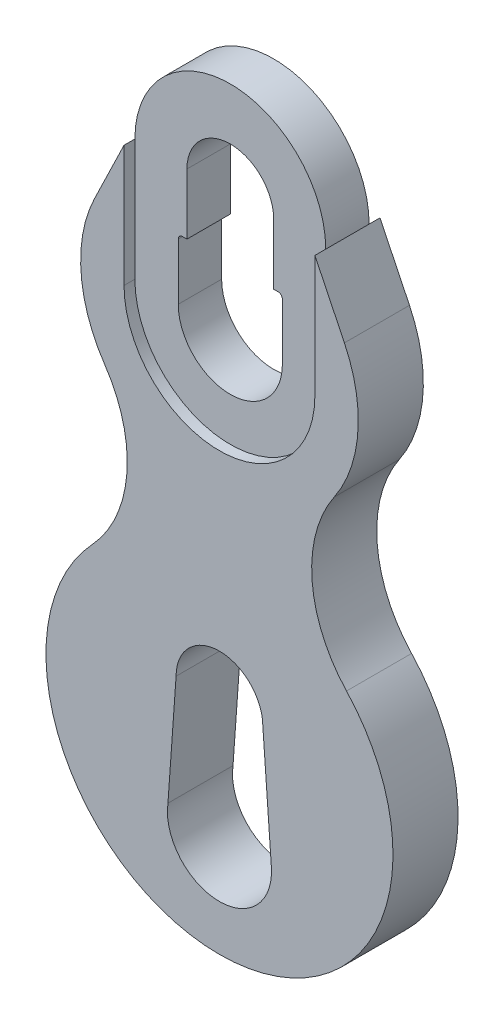
ISO-10303-21;
HEADER;
FILE_DESCRIPTION(('STEP AP214'),'2;1');
FILE_NAME('part.step','',(''),(''),'','','');
FILE_SCHEMA(('AUTOMOTIVE_DESIGN { 1 0 10303 214 1 1 1 1 }'));
ENDSEC;
DATA;
#1=APPLICATION_CONTEXT('core data for automotive mechanical design processes');
#2=APPLICATION_PROTOCOL_DEFINITION('international standard','automotive_design',2000,#1);
#3=PRODUCT_CONTEXT('',#1,'mechanical');
#4=PRODUCT('Part','Part','',(#3));
#5=PRODUCT_RELATED_PRODUCT_CATEGORY('part','',(#4));
#6=PRODUCT_DEFINITION_FORMATION('','',#4);
#7=PRODUCT_DEFINITION_CONTEXT('part definition',#1,'design');
#8=PRODUCT_DEFINITION('design','',#6,#7);
#9=PRODUCT_DEFINITION_SHAPE('','',#8);
#10=(LENGTH_UNIT() NAMED_UNIT(*) SI_UNIT(.MILLI.,.METRE.));
#11=(NAMED_UNIT(*) PLANE_ANGLE_UNIT() SI_UNIT($,.RADIAN.));
#12=(NAMED_UNIT(*) SI_UNIT($,.STERADIAN.) SOLID_ANGLE_UNIT());
#13=UNCERTAINTY_MEASURE_WITH_UNIT(LENGTH_MEASURE(1.E-05),#10,'distance_accuracy_value','');
#14=(GEOMETRIC_REPRESENTATION_CONTEXT(3) GLOBAL_UNCERTAINTY_ASSIGNED_CONTEXT((#13)) GLOBAL_UNIT_ASSIGNED_CONTEXT((#10,
#11,#12)) REPRESENTATION_CONTEXT('',''));
#15=CARTESIAN_POINT('',(0.,0.,0.));
#16=DIRECTION('',(0.,0.,1.));
#17=DIRECTION('',(1.,0.,0.));
#18=AXIS2_PLACEMENT_3D('',#15,#16,#17);
#19=CARTESIAN_POINT('',(-10.9999999999939,95.5634073663437,5.));
#20=DIRECTION('',(0.,0.,-1.));
#21=DIRECTION('',(-1.,0.,0.));
#22=AXIS2_PLACEMENT_3D('',#19,#20,#21);
#23=CYLINDRICAL_SURFACE('',#22,1.);
#24=CARTESIAN_POINT('',(-10.9999999999939,95.5634073663437,-5.));
#25=DIRECTION('',(0.,0.,1.));
#26=DIRECTION('',(1.,0.,0.));
#27=AXIS2_PLACEMENT_3D('',#24,#25,#26);
#28=CIRCLE('',#27,1.);
#29=CARTESIAN_POINT('',(-10.9999999999939,96.5634073663437,-5.));
#30=VERTEX_POINT('',#29);
#31=CARTESIAN_POINT('',(-11.9999999999939,95.5634073663437,-5.));
#32=VERTEX_POINT('',#31);
#33=EDGE_CURVE('E190',#30,#32,#28,.T.);
#34=ORIENTED_EDGE('',*,*,#33,.F.);
#35=DIRECTION('',(0.,0.,-1.));
#36=VECTOR('',#35,1.);
#37=CARTESIAN_POINT('',(-10.9999999999939,96.5634073663437,5.));
#38=LINE('',#37,#36);
#39=CARTESIAN_POINT('',(-10.9999999999939,96.5634073663437,5.));
#40=VERTEX_POINT('',#39);
#41=EDGE_CURVE('E48',#40,#30,#38,.T.);
#42=ORIENTED_EDGE('',*,*,#41,.F.);
#43=CARTESIAN_POINT('',(-10.9999999999939,95.5634073663437,5.));
#44=DIRECTION('',(0.,0.,1.));
#45=DIRECTION('',(1.,0.,0.));
#46=AXIS2_PLACEMENT_3D('',#43,#44,#45);
#47=CIRCLE('',#46,1.);
#48=CARTESIAN_POINT('',(-11.9999999999939,95.5634073663437,5.));
#49=VERTEX_POINT('',#48);
#50=EDGE_CURVE('E205',#40,#49,#47,.T.);
#51=ORIENTED_EDGE('',*,*,#50,.T.);
#52=DIRECTION('',(0.,0.,-1.));
#53=VECTOR('',#52,1.);
#54=CARTESIAN_POINT('',(-11.9999999999939,95.5634073663437,5.));
#55=LINE('',#54,#53);
#56=EDGE_CURVE('E232',#49,#32,#55,.T.);
#57=ORIENTED_EDGE('',*,*,#56,.T.);
#58=EDGE_LOOP('',(#34,#42,#51,#57));
#59=FACE_BOUND('',#58,.T.);
#60=ADVANCED_FACE('F45',(#59),#23,.F.);
#61=CARTESIAN_POINT('',(0.,96.5634073663437,5.));
#62=DIRECTION('',(0.,-1.,0.));
#63=DIRECTION('',(0.,0.,-1.));
#64=AXIS2_PLACEMENT_3D('',#61,#62,#63);
#65=PLANE('',#64);
#66=DIRECTION('',(-1.,0.,0.));
#67=VECTOR('',#66,1.);
#68=CARTESIAN_POINT('',(0.,96.5634073663437,-5.));
#69=LINE('',#68,#67);
#70=CARTESIAN_POINT('',(-9.99999999999389,96.5634073663437,-5.));
#71=VERTEX_POINT('',#70);
#72=EDGE_CURVE('E235',#71,#30,#69,.T.);
#73=ORIENTED_EDGE('',*,*,#72,.F.);
#74=DIRECTION('',(0.,0.,-1.));
#75=VECTOR('',#74,1.);
#76=CARTESIAN_POINT('',(-9.99999999999389,96.5634073663437,5.));
#77=LINE('',#76,#75);
#78=CARTESIAN_POINT('',(-9.99999999999389,96.5634073663437,5.));
#79=VERTEX_POINT('',#78);
#80=EDGE_CURVE('E287',#79,#71,#77,.T.);
#81=ORIENTED_EDGE('',*,*,#80,.F.);
#82=DIRECTION('',(-1.,0.,0.));
#83=VECTOR('',#82,1.);
#84=CARTESIAN_POINT('',(0.,96.5634073663437,5.));
#85=LINE('',#84,#83);
#86=EDGE_CURVE('E207',#79,#40,#85,.T.);
#87=ORIENTED_EDGE('',*,*,#86,.T.);
#88=ORIENTED_EDGE('',*,*,#41,.T.);
#89=EDGE_LOOP('',(#73,#81,#87,#88));
#90=FACE_BOUND('',#89,.T.);
#91=ADVANCED_FACE('F292',(#90),#65,.T.);
#92=CARTESIAN_POINT('',(-9.99999999999385,0.,5.));
#93=DIRECTION('',(1.,0.,0.));
#94=DIRECTION('',(0.,1.,0.));
#95=AXIS2_PLACEMENT_3D('',#92,#93,#94);
#96=PLANE('',#95);
#97=DIRECTION('',(0.,-1.,0.));
#98=VECTOR('',#97,1.);
#99=CARTESIAN_POINT('',(-9.99999999999385,0.,-5.));
#100=LINE('',#99,#98);
#101=CARTESIAN_POINT('',(-9.99999999999389,110.563407366342,-5.));
#102=VERTEX_POINT('',#101);
#103=EDGE_CURVE('E238',#102,#71,#100,.T.);
#104=ORIENTED_EDGE('',*,*,#103,.F.);
#105=DIRECTION('',(0.,0.,-1.));
#106=VECTOR('',#105,1.);
#107=CARTESIAN_POINT('',(-9.99999999999389,110.563407366342,5.));
#108=LINE('',#107,#106);
#109=CARTESIAN_POINT('',(-9.99999999999389,110.563407366342,5.));
#110=VERTEX_POINT('',#109);
#111=EDGE_CURVE('E286',#110,#102,#108,.T.);
#112=ORIENTED_EDGE('',*,*,#111,.F.);
#113=DIRECTION('',(0.,-1.,0.));
#114=VECTOR('',#113,1.);
#115=CARTESIAN_POINT('',(-9.99999999999385,0.,5.));
#116=LINE('',#115,#114);
#117=EDGE_CURVE('E210',#110,#79,#116,.T.);
#118=ORIENTED_EDGE('',*,*,#117,.T.);
#119=ORIENTED_EDGE('',*,*,#80,.T.);
#120=EDGE_LOOP('',(#104,#112,#118,#119));
#121=FACE_BOUND('',#120,.T.);
#122=ADVANCED_FACE('F300',(#121),#96,.T.);
#123=CARTESIAN_POINT('',(6.10969388344336E-12,110.563407366342,5.));
#124=DIRECTION('',(0.,0.,-1.));
#125=DIRECTION('',(-1.,0.,0.));
#126=AXIS2_PLACEMENT_3D('',#123,#124,#125);
#127=CYLINDRICAL_SURFACE('',#126,10.);
#128=CARTESIAN_POINT('',(6.10969388344336E-12,110.563407366342,-5.));
#129=DIRECTION('',(0.,0.,1.));
#130=DIRECTION('',(1.,0.,0.));
#131=AXIS2_PLACEMENT_3D('',#128,#129,#130);
#132=CIRCLE('',#131,10.);
#133=CARTESIAN_POINT('',(10.0000000000061,110.563407366342,-5.));
#134=VERTEX_POINT('',#133);
#135=EDGE_CURVE('E241',#134,#102,#132,.T.);
#136=ORIENTED_EDGE('',*,*,#135,.F.);
#137=DIRECTION('',(0.,0.,-1.));
#138=VECTOR('',#137,1.);
#139=CARTESIAN_POINT('',(10.0000000000061,110.563407366342,5.));
#140=LINE('',#139,#138);
#141=CARTESIAN_POINT('',(10.0000000000061,110.563407366342,5.));
#142=VERTEX_POINT('',#141);
#143=EDGE_CURVE('E284',#142,#134,#140,.T.);
#144=ORIENTED_EDGE('',*,*,#143,.F.);
#145=CARTESIAN_POINT('',(6.10969388344336E-12,110.563407366342,5.));
#146=DIRECTION('',(0.,0.,1.));
#147=DIRECTION('',(1.,0.,0.));
#148=AXIS2_PLACEMENT_3D('',#145,#146,#147);
#149=CIRCLE('',#148,10.);
#150=EDGE_CURVE('E213',#142,#110,#149,.T.);
#151=ORIENTED_EDGE('',*,*,#150,.T.);
#152=ORIENTED_EDGE('',*,*,#111,.T.);
#153=EDGE_LOOP('',(#136,#144,#151,#152));
#154=FACE_BOUND('',#153,.T.);
#155=ADVANCED_FACE('F305',(#154),#127,.F.);
#156=CARTESIAN_POINT('',(10.0000000000061,0.,5.));
#157=DIRECTION('',(1.,0.,0.));
#158=DIRECTION('',(0.,1.,0.));
#159=AXIS2_PLACEMENT_3D('',#156,#157,#158);
#160=PLANE('',#159);
#161=DIRECTION('',(0.,-1.,0.));
#162=VECTOR('',#161,1.);
#163=CARTESIAN_POINT('',(10.0000000000061,0.,-5.));
#164=LINE('',#163,#162);
#165=CARTESIAN_POINT('',(10.0000000000061,96.5634073663437,-5.));
#166=VERTEX_POINT('',#165);
#167=EDGE_CURVE('E244',#134,#166,#164,.T.);
#168=ORIENTED_EDGE('',*,*,#167,.T.);
#169=DIRECTION('',(0.,0.,-1.));
#170=VECTOR('',#169,1.);
#171=CARTESIAN_POINT('',(10.0000000000061,96.5634073663437,5.));
#172=LINE('',#171,#170);
#173=CARTESIAN_POINT('',(10.0000000000061,96.5634073663437,5.));
#174=VERTEX_POINT('',#173);
#175=EDGE_CURVE('E281',#174,#166,#172,.T.);
#176=ORIENTED_EDGE('',*,*,#175,.F.);
#177=DIRECTION('',(0.,-1.,0.));
#178=VECTOR('',#177,1.);
#179=CARTESIAN_POINT('',(10.0000000000061,0.,5.));
#180=LINE('',#179,#178);
#181=EDGE_CURVE('E216',#142,#174,#180,.T.);
#182=ORIENTED_EDGE('',*,*,#181,.F.);
#183=ORIENTED_EDGE('',*,*,#143,.T.);
#184=EDGE_LOOP('',(#168,#176,#182,#183));
#185=FACE_BOUND('',#184,.T.);
#186=ADVANCED_FACE('F309',(#185),#160,.F.);
#187=CARTESIAN_POINT('',(0.,96.5634073663437,5.));
#188=DIRECTION('',(0.,1.,0.));
#189=DIRECTION('',(0.,0.,1.));
#190=AXIS2_PLACEMENT_3D('',#187,#188,#189);
#191=PLANE('',#190);
#192=DIRECTION('',(1.,0.,0.));
#193=VECTOR('',#192,1.);
#194=CARTESIAN_POINT('',(0.,96.5634073663437,-5.));
#195=LINE('',#194,#193);
#196=CARTESIAN_POINT('',(11.0000000000061,96.5634073663437,-5.));
#197=VERTEX_POINT('',#196);
#198=EDGE_CURVE('E246',#166,#197,#195,.T.);
#199=ORIENTED_EDGE('',*,*,#198,.T.);
#200=DIRECTION('',(0.,0.,-1.));
#201=VECTOR('',#200,1.);
#202=CARTESIAN_POINT('',(11.0000000000061,96.5634073663437,5.));
#203=LINE('',#202,#201);
#204=CARTESIAN_POINT('',(11.0000000000061,96.5634073663437,5.));
#205=VERTEX_POINT('',#204);
#206=EDGE_CURVE('E278',#205,#197,#203,.T.);
#207=ORIENTED_EDGE('',*,*,#206,.F.);
#208=DIRECTION('',(1.,0.,0.));
#209=VECTOR('',#208,1.);
#210=CARTESIAN_POINT('',(0.,96.5634073663437,5.));
#211=LINE('',#210,#209);
#212=EDGE_CURVE('E218',#174,#205,#211,.T.);
#213=ORIENTED_EDGE('',*,*,#212,.F.);
#214=ORIENTED_EDGE('',*,*,#175,.T.);
#215=EDGE_LOOP('',(#199,#207,#213,#214));
#216=FACE_BOUND('',#215,.T.);
#217=ADVANCED_FACE('F315',(#216),#191,.F.);
#218=CARTESIAN_POINT('',(11.0000000000061,95.5634073663437,5.));
#219=DIRECTION('',(0.,0.,-1.));
#220=DIRECTION('',(-1.,0.,0.));
#221=AXIS2_PLACEMENT_3D('',#218,#219,#220);
#222=CYLINDRICAL_SURFACE('',#221,1.);
#223=CARTESIAN_POINT('',(11.0000000000061,95.5634073663437,-5.));
#224=DIRECTION('',(0.,0.,1.));
#225=DIRECTION('',(1.,0.,0.));
#226=AXIS2_PLACEMENT_3D('',#223,#224,#225);
#227=CIRCLE('',#226,1.);
#228=CARTESIAN_POINT('',(12.0000000000061,95.5634073663437,-5.));
#229=VERTEX_POINT('',#228);
#230=EDGE_CURVE('E248',#197,#229,#227,.F.);
#231=ORIENTED_EDGE('',*,*,#230,.T.);
#232=DIRECTION('',(0.,0.,-1.));
#233=VECTOR('',#232,1.);
#234=CARTESIAN_POINT('',(12.0000000000061,95.5634073663437,5.));
#235=LINE('',#234,#233);
#236=CARTESIAN_POINT('',(12.0000000000061,95.5634073663437,5.));
#237=VERTEX_POINT('',#236);
#238=EDGE_CURVE('E275',#237,#229,#235,.T.);
#239=ORIENTED_EDGE('',*,*,#238,.F.);
#240=CARTESIAN_POINT('',(11.0000000000061,95.5634073663437,5.));
#241=DIRECTION('',(0.,0.,1.));
#242=DIRECTION('',(1.,0.,0.));
#243=AXIS2_PLACEMENT_3D('',#240,#241,#242);
#244=CIRCLE('',#243,1.);
#245=EDGE_CURVE('E220',#205,#237,#244,.F.);
#246=ORIENTED_EDGE('',*,*,#245,.F.);
#247=ORIENTED_EDGE('',*,*,#206,.T.);
#248=EDGE_LOOP('',(#231,#239,#246,#247));
#249=FACE_BOUND('',#248,.T.);
#250=ADVANCED_FACE('F319',(#249),#222,.F.);
#251=CARTESIAN_POINT('',(12.0000000000061,0.,5.));
#252=DIRECTION('',(1.,0.,0.));
#253=DIRECTION('',(0.,1.,0.));
#254=AXIS2_PLACEMENT_3D('',#251,#252,#253);
#255=PLANE('',#254);
#256=DIRECTION('',(0.,-1.,0.));
#257=VECTOR('',#256,1.);
#258=CARTESIAN_POINT('',(12.0000000000061,0.,-5.));
#259=LINE('',#258,#257);
#260=CARTESIAN_POINT('',(12.0000000000061,82.5634073663423,-5.));
#261=VERTEX_POINT('',#260);
#262=EDGE_CURVE('E250',#229,#261,#259,.T.);
#263=ORIENTED_EDGE('',*,*,#262,.T.);
#264=DIRECTION('',(0.,0.,-1.));
#265=VECTOR('',#264,1.);
#266=CARTESIAN_POINT('',(12.0000000000061,82.5634073663423,5.));
#267=LINE('',#266,#265);
#268=CARTESIAN_POINT('',(12.0000000000061,82.5634073663423,5.));
#269=VERTEX_POINT('',#268);
#270=EDGE_CURVE('E273',#269,#261,#267,.T.);
#271=ORIENTED_EDGE('',*,*,#270,.F.);
#272=DIRECTION('',(0.,-1.,0.));
#273=VECTOR('',#272,1.);
#274=CARTESIAN_POINT('',(12.0000000000061,0.,5.));
#275=LINE('',#274,#273);
#276=EDGE_CURVE('E222',#237,#269,#275,.T.);
#277=ORIENTED_EDGE('',*,*,#276,.F.);
#278=ORIENTED_EDGE('',*,*,#238,.T.);
#279=EDGE_LOOP('',(#263,#271,#277,#278));
#280=FACE_BOUND('',#279,.T.);
#281=ADVANCED_FACE('F324',(#280),#255,.F.);
#282=CARTESIAN_POINT('',(0.,82.5634073663423,5.));
#283=DIRECTION('',(0.,0.,-1.));
#284=DIRECTION('',(-1.,0.,0.));
#285=AXIS2_PLACEMENT_3D('',#282,#283,#284);
#286=CYLINDRICAL_SURFACE('',#285,12.);
#287=CARTESIAN_POINT('',(0.,82.5634073663423,-5.));
#288=DIRECTION('',(0.,0.,1.));
#289=DIRECTION('',(1.,0.,0.));
#290=AXIS2_PLACEMENT_3D('',#287,#288,#289);
#291=CIRCLE('',#290,12.);
#292=CARTESIAN_POINT('',(-11.9999999999939,82.5634073663423,-5.));
#293=VERTEX_POINT('',#292);
#294=EDGE_CURVE('E253',#293,#261,#291,.T.);
#295=ORIENTED_EDGE('',*,*,#294,.F.);
#296=DIRECTION('',(0.,0.,-1.));
#297=VECTOR('',#296,1.);
#298=CARTESIAN_POINT('',(-11.9999999999939,82.5634073663423,5.));
#299=LINE('',#298,#297);
#300=CARTESIAN_POINT('',(-11.9999999999939,82.5634073663423,5.));
#301=VERTEX_POINT('',#300);
#302=EDGE_CURVE('E271',#301,#293,#299,.T.);
#303=ORIENTED_EDGE('',*,*,#302,.F.);
#304=CARTESIAN_POINT('',(0.,82.5634073663423,5.));
#305=DIRECTION('',(0.,0.,1.));
#306=DIRECTION('',(1.,0.,0.));
#307=AXIS2_PLACEMENT_3D('',#304,#305,#306);
#308=CIRCLE('',#307,12.);
#309=EDGE_CURVE('E224',#301,#269,#308,.T.);
#310=ORIENTED_EDGE('',*,*,#309,.T.);
#311=ORIENTED_EDGE('',*,*,#270,.T.);
#312=EDGE_LOOP('',(#295,#303,#310,#311));
#313=FACE_BOUND('',#312,.T.);
#314=ADVANCED_FACE('F331',(#313),#286,.F.);
#315=CARTESIAN_POINT('',(-11.9999999999939,0.,5.));
#316=DIRECTION('',(1.,0.,0.));
#317=DIRECTION('',(0.,1.,0.));
#318=AXIS2_PLACEMENT_3D('',#315,#316,#317);
#319=PLANE('',#318);
#320=DIRECTION('',(0.,-1.,0.));
#321=VECTOR('',#320,1.);
#322=CARTESIAN_POINT('',(-11.9999999999939,0.,-5.));
#323=LINE('',#322,#321);
#324=EDGE_CURVE('E256',#32,#293,#323,.T.);
#325=ORIENTED_EDGE('',*,*,#324,.F.);
#326=ORIENTED_EDGE('',*,*,#56,.F.);
#327=DIRECTION('',(0.,-1.,0.));
#328=VECTOR('',#327,1.);
#329=CARTESIAN_POINT('',(-11.9999999999939,0.,5.));
#330=LINE('',#329,#328);
#331=EDGE_CURVE('E227',#49,#301,#330,.T.);
#332=ORIENTED_EDGE('',*,*,#331,.T.);
#333=ORIENTED_EDGE('',*,*,#302,.T.);
#334=EDGE_LOOP('',(#325,#326,#332,#333));
#335=FACE_BOUND('',#334,.T.);
#336=ADVANCED_FACE('F329',(#335),#319,.T.);
#337=CARTESIAN_POINT('',(6.10969388344336E-12,110.563407366342,5.));
#338=DIRECTION('',(0.,0.,-1.));
#339=DIRECTION('',(-1.,0.,0.));
#340=AXIS2_PLACEMENT_3D('',#337,#338,#339);
#341=CYLINDRICAL_SURFACE('',#340,21.9999999999939);
#342=CARTESIAN_POINT('',(6.10969388344336E-12,110.563407366342,-5.));
#343=DIRECTION('',(0.,0.,1.));
#344=DIRECTION('',(1.,0.,0.));
#345=AXIS2_PLACEMENT_3D('',#342,#343,#344);
#346=CIRCLE('',#345,21.9999999999939);
#347=CARTESIAN_POINT('',(21.9999999999939,110.563407366328,-5.));
#348=VERTEX_POINT('',#347);
#349=CARTESIAN_POINT('',(-21.9999999999939,110.563407366328,-5.));
#350=VERTEX_POINT('',#349);
#351=EDGE_CURVE('E108',#348,#350,#346,.T.);
#352=ORIENTED_EDGE('',*,*,#351,.T.);
#353=DIRECTION('',(0.,0.,-1.));
#354=VECTOR('',#353,1.);
#355=CARTESIAN_POINT('',(-21.9999999999939,110.563407366328,5.));
#356=LINE('',#355,#354);
#357=CARTESIAN_POINT('',(-21.9999999999939,110.563407366328,5.));
#358=VERTEX_POINT('',#357);
#359=EDGE_CURVE('E54',#358,#350,#356,.T.);
#360=ORIENTED_EDGE('',*,*,#359,.F.);
#361=CARTESIAN_POINT('',(6.10969388344336E-12,110.563407366342,5.));
#362=DIRECTION('',(0.,0.,1.));
#363=DIRECTION('',(1.,0.,0.));
#364=AXIS2_PLACEMENT_3D('',#361,#362,#363);
#365=CIRCLE('',#364,21.9999999999939);
#366=CARTESIAN_POINT('',(21.9999999999939,110.563407366328,5.));
#367=VERTEX_POINT('',#366);
#368=EDGE_CURVE('E63',#367,#358,#365,.T.);
#369=ORIENTED_EDGE('',*,*,#368,.F.);
#370=DIRECTION('',(0.,0.,-1.));
#371=VECTOR('',#370,1.);
#372=CARTESIAN_POINT('',(21.9999999999939,110.563407366328,5.));
#373=LINE('',#372,#371);
#374=EDGE_CURVE('E11',#367,#348,#373,.T.);
#375=ORIENTED_EDGE('',*,*,#374,.T.);
#376=EDGE_LOOP('',(#352,#360,#369,#375));
#377=FACE_BOUND('',#376,.T.);
#378=ADVANCED_FACE('F338',(#377),#341,.T.);
#379=CARTESIAN_POINT('',(0.,0.,5.));
#380=DIRECTION('',(0.,0.,1.));
#381=DIRECTION('',(1.,0.,0.));
#382=AXIS2_PLACEMENT_3D('',#379,#380,#381);
#383=PLANE('',#382);
#384=ORIENTED_EDGE('',*,*,#50,.F.);
#385=ORIENTED_EDGE('',*,*,#86,.F.);
#386=ORIENTED_EDGE('',*,*,#117,.F.);
#387=ORIENTED_EDGE('',*,*,#150,.F.);
#388=ORIENTED_EDGE('',*,*,#181,.T.);
#389=ORIENTED_EDGE('',*,*,#212,.T.);
#390=ORIENTED_EDGE('',*,*,#245,.T.);
#391=ORIENTED_EDGE('',*,*,#276,.T.);
#392=ORIENTED_EDGE('',*,*,#309,.F.);
#393=ORIENTED_EDGE('',*,*,#331,.F.);
#394=EDGE_LOOP('',(#384,#385,#386,#387,#388,#389,#390,#391,#392,#393));
#395=FACE_BOUND('',#394,.T.);
#396=DIRECTION('',(6.4878658001525E-13,-1.,0.));
#397=VECTOR('',#396,1.);
#398=CARTESIAN_POINT('',(-21.9999999999222,-1.4273304760285E-11,5.));
#399=LINE('',#398,#397);
#400=CARTESIAN_POINT('',(-21.9999999999757,82.5634073663248,5.));
#401=VERTEX_POINT('',#400);
#402=EDGE_CURVE('E154',#358,#401,#399,.T.);
#403=ORIENTED_EDGE('',*,*,#402,.T.);
#404=CARTESIAN_POINT('',(0.,82.5634073663423,5.));
#405=DIRECTION('',(0.,0.,1.));
#406=DIRECTION('',(1.,0.,0.));
#407=AXIS2_PLACEMENT_3D('',#404,#405,#406);
#408=CIRCLE('',#407,21.9999999999757);
#409=CARTESIAN_POINT('',(21.9999999999757,82.563407366328,5.));
#410=VERTEX_POINT('',#409);
#411=EDGE_CURVE('E149',#401,#410,#408,.T.);
#412=ORIENTED_EDGE('',*,*,#411,.T.);
#413=DIRECTION('',(-6.48786580015326E-13,-1.,0.));
#414=VECTOR('',#413,1.);
#415=CARTESIAN_POINT('',(21.9999999999222,-1.42733047602867E-11,5.));
#416=LINE('',#415,#414);
#417=EDGE_CURVE('E152',#367,#410,#416,.T.);
#418=ORIENTED_EDGE('',*,*,#417,.F.);
#419=ORIENTED_EDGE('',*,*,#368,.T.);
#420=EDGE_LOOP('',(#403,#412,#418,#419));
#421=FACE_BOUND('',#420,.T.);
#422=ADVANCED_FACE('F151',(#395,#421),#383,.T.);
#423=CARTESIAN_POINT('',(0.,0.,-5.));
#424=DIRECTION('',(0.,0.,1.));
#425=DIRECTION('',(1.,0.,0.));
#426=AXIS2_PLACEMENT_3D('',#423,#424,#425);
#427=PLANE('',#426);
#428=ORIENTED_EDGE('',*,*,#33,.T.);
#429=ORIENTED_EDGE('',*,*,#324,.T.);
#430=ORIENTED_EDGE('',*,*,#294,.T.);
#431=ORIENTED_EDGE('',*,*,#262,.F.);
#432=ORIENTED_EDGE('',*,*,#230,.F.);
#433=ORIENTED_EDGE('',*,*,#198,.F.);
#434=ORIENTED_EDGE('',*,*,#167,.F.);
#435=ORIENTED_EDGE('',*,*,#135,.T.);
#436=ORIENTED_EDGE('',*,*,#103,.T.);
#437=ORIENTED_EDGE('',*,*,#72,.T.);
#438=EDGE_LOOP('',(#428,#429,#430,#431,#432,#433,#434,#435,#436,#437));
#439=FACE_BOUND('',#438,.T.);
#440=DIRECTION('',(6.4878658001525E-13,-1.,0.));
#441=VECTOR('',#440,1.);
#442=CARTESIAN_POINT('',(-21.9999999999222,-1.4273304760285E-11,-5.));
#443=LINE('',#442,#441);
#444=CARTESIAN_POINT('',(-21.9999999999757,82.5634073663248,-5.));
#445=VERTEX_POINT('',#444);
#446=EDGE_CURVE('E259',#350,#445,#443,.T.);
#447=ORIENTED_EDGE('',*,*,#446,.F.);
#448=ORIENTED_EDGE('',*,*,#351,.F.);
#449=DIRECTION('',(-6.48786580015326E-13,-1.,0.));
#450=VECTOR('',#449,1.);
#451=CARTESIAN_POINT('',(21.9999999999222,-1.42733047602867E-11,-5.));
#452=LINE('',#451,#450);
#453=CARTESIAN_POINT('',(21.9999999999757,82.563407366328,-5.));
#454=VERTEX_POINT('',#453);
#455=EDGE_CURVE('E265',#348,#454,#452,.T.);
#456=ORIENTED_EDGE('',*,*,#455,.T.);
#457=CARTESIAN_POINT('',(0.,82.5634073663423,-5.));
#458=DIRECTION('',(0.,0.,1.));
#459=DIRECTION('',(1.,0.,0.));
#460=AXIS2_PLACEMENT_3D('',#457,#458,#459);
#461=CIRCLE('',#460,21.9999999999757);
#462=EDGE_CURVE('E262',#445,#454,#461,.T.);
#463=ORIENTED_EDGE('',*,*,#462,.F.);
#464=EDGE_LOOP('',(#447,#448,#456,#463));
#465=FACE_BOUND('',#464,.T.);
#466=ADVANCED_FACE('F296',(#439,#465),#427,.F.);
#467=CARTESIAN_POINT('',(21.9999999999222,-1.42733047602867E-11,7.5));
#468=DIRECTION('',(1.,-6.48786580015326E-13,0.));
#469=DIRECTION('',(6.48786580015326E-13,1.,0.));
#470=AXIS2_PLACEMENT_3D('',#467,#468,#469);
#471=PLANE('',#470);
#472=DIRECTION('',(0.,0.,-1.));
#473=VECTOR('',#472,1.);
#474=CARTESIAN_POINT('',(21.9999999999757,82.563407366328,7.5));
#475=LINE('',#474,#473);
#476=CARTESIAN_POINT('',(21.9999999999757,82.563407366328,-7.5));
#477=VERTEX_POINT('',#476);
#478=EDGE_CURVE('E175',#454,#477,#475,.T.);
#479=ORIENTED_EDGE('',*,*,#478,.F.);
#480=ORIENTED_EDGE('',*,*,#455,.F.);
#481=DIRECTION('',(0.,0.,-1.));
#482=VECTOR('',#481,1.);
#483=CARTESIAN_POINT('',(21.9999999999939,110.563407366328,7.5));
#484=LINE('',#483,#482);
#485=CARTESIAN_POINT('',(21.9999999999939,110.563407366328,-7.5));
#486=VERTEX_POINT('',#485);
#487=EDGE_CURVE('E174',#348,#486,#484,.T.);
#488=ORIENTED_EDGE('',*,*,#487,.T.);
#489=DIRECTION('',(-6.48786580015326E-13,-1.,0.));
#490=VECTOR('',#489,1.);
#491=CARTESIAN_POINT('',(21.9999999999222,-1.42733047602867E-11,-7.5));
#492=LINE('',#491,#490);
#493=EDGE_CURVE('E622',#486,#477,#492,.T.);
#494=ORIENTED_EDGE('',*,*,#493,.T.);
#495=EDGE_LOOP('',(#479,#480,#488,#494));
#496=FACE_BOUND('',#495,.T.);
#497=ADVANCED_FACE('F402',(#496),#471,.F.);
#498=CARTESIAN_POINT('',(0.,82.5634073663423,7.5));
#499=DIRECTION('',(0.,0.,-1.));
#500=DIRECTION('',(-1.,0.,0.));
#501=AXIS2_PLACEMENT_3D('',#498,#499,#500);
#502=CYLINDRICAL_SURFACE('',#501,21.9999999999757);
#503=ORIENTED_EDGE('',*,*,#462,.T.);
#504=ORIENTED_EDGE('',*,*,#478,.T.);
#505=CARTESIAN_POINT('',(0.,82.5634073663423,-7.5));
#506=DIRECTION('',(0.,0.,1.));
#507=DIRECTION('',(1.,0.,0.));
#508=AXIS2_PLACEMENT_3D('',#505,#506,#507);
#509=CIRCLE('',#508,21.9999999999757);
#510=CARTESIAN_POINT('',(-21.9999999999757,82.5634073663248,-7.5));
#511=VERTEX_POINT('',#510);
#512=EDGE_CURVE('E625',#511,#477,#509,.T.);
#513=ORIENTED_EDGE('',*,*,#512,.F.);
#514=DIRECTION('',(0.,0.,-1.));
#515=VECTOR('',#514,1.);
#516=CARTESIAN_POINT('',(-21.9999999999757,82.5634073663248,7.5));
#517=LINE('',#516,#515);
#518=EDGE_CURVE('E653',#445,#511,#517,.T.);
#519=ORIENTED_EDGE('',*,*,#518,.F.);
#520=EDGE_LOOP('',(#503,#504,#513,#519));
#521=FACE_BOUND('',#520,.T.);
#522=ADVANCED_FACE('F411',(#521),#502,.F.);
#523=CARTESIAN_POINT('',(-21.9999999999222,-1.4273304760285E-11,7.5));
#524=DIRECTION('',(1.,6.4878658001525E-13,0.));
#525=DIRECTION('',(-6.4878658001525E-13,1.,0.));
#526=AXIS2_PLACEMENT_3D('',#523,#524,#525);
#527=PLANE('',#526);
#528=ORIENTED_EDGE('',*,*,#446,.T.);
#529=ORIENTED_EDGE('',*,*,#518,.T.);
#530=DIRECTION('',(6.4878658001525E-13,-1.,0.));
#531=VECTOR('',#530,1.);
#532=CARTESIAN_POINT('',(-21.9999999999222,-1.4273304760285E-11,-7.5));
#533=LINE('',#532,#531);
#534=CARTESIAN_POINT('',(-21.9999999999939,110.563407366328,-7.5));
#535=VERTEX_POINT('',#534);
#536=EDGE_CURVE('E628',#535,#511,#533,.T.);
#537=ORIENTED_EDGE('',*,*,#536,.F.);
#538=DIRECTION('',(0.,0.,-1.));
#539=VECTOR('',#538,1.);
#540=CARTESIAN_POINT('',(-21.9999999999939,110.563407366328,7.5));
#541=LINE('',#540,#539);
#542=EDGE_CURVE('E650',#350,#535,#541,.T.);
#543=ORIENTED_EDGE('',*,*,#542,.F.);
#544=EDGE_LOOP('',(#528,#529,#537,#543));
#545=FACE_BOUND('',#544,.T.);
#546=ADVANCED_FACE('F421',(#545),#527,.T.);
#547=CARTESIAN_POINT('',(51.2535250504479,47.6767885863038,7.5));
#548=DIRECTION('',(0.,0.,-1.));
#549=DIRECTION('',(-1.,0.,0.));
#550=AXIS2_PLACEMENT_3D('',#547,#548,#549);
#551=CYLINDRICAL_SURFACE('',#550,29.9999999999974);
#552=CARTESIAN_POINT('',(51.2535250504479,47.6767885863038,-7.5));
#553=DIRECTION('',(0.,0.,1.));
#554=DIRECTION('',(1.,0.,0.));
#555=AXIS2_PLACEMENT_3D('',#552,#553,#554);
#556=CIRCLE('',#555,29.9999999999974);
#557=CARTESIAN_POINT('',(26.4534322841072,64.5574105766436,-7.5));
#558=VERTEX_POINT('',#557);
#559=CARTESIAN_POINT('',(29.287728600252,27.2438791921788,-7.5));
#560=VERTEX_POINT('',#559);
#561=EDGE_CURVE('E599',#558,#560,#556,.T.);
#562=ORIENTED_EDGE('',*,*,#561,.F.);
#563=DIRECTION('',(0.,0.,-1.));
#564=VECTOR('',#563,1.);
#565=CARTESIAN_POINT('',(26.4534322841072,64.5574105766436,7.5));
#566=LINE('',#565,#564);
#567=CARTESIAN_POINT('',(26.4534322841072,64.5574105766436,7.5));
#568=VERTEX_POINT('',#567);
#569=EDGE_CURVE('E187',#568,#558,#566,.T.);
#570=ORIENTED_EDGE('',*,*,#569,.F.);
#571=CARTESIAN_POINT('',(51.2535250504479,47.6767885863038,7.5));
#572=DIRECTION('',(0.,0.,1.));
#573=DIRECTION('',(1.,0.,0.));
#574=AXIS2_PLACEMENT_3D('',#571,#572,#573);
#575=CIRCLE('',#574,29.9999999999974);
#576=CARTESIAN_POINT('',(29.287728600252,27.2438791921788,7.5));
#577=VERTEX_POINT('',#576);
#578=EDGE_CURVE('E728',#568,#577,#575,.T.);
#579=ORIENTED_EDGE('',*,*,#578,.T.);
#580=DIRECTION('',(0.,0.,-1.));
#581=VECTOR('',#580,1.);
#582=CARTESIAN_POINT('',(29.287728600252,27.2438791921788,7.5));
#583=LINE('',#582,#581);
#584=EDGE_CURVE('E204',#577,#560,#583,.T.);
#585=ORIENTED_EDGE('',*,*,#584,.T.);
#586=EDGE_LOOP('',(#562,#570,#579,#585));
#587=FACE_BOUND('',#586,.T.);
#588=ADVANCED_FACE('F431',(#587),#551,.F.);
#589=CARTESIAN_POINT('',(-6.11170063566874E-12,82.5634073663453,7.5));
#590=DIRECTION('',(0.,0.,-1.));
#591=DIRECTION('',(-1.,0.,0.));
#592=AXIS2_PLACEMENT_3D('',#589,#590,#591);
#593=CYLINDRICAL_SURFACE('',#592,31.9999999998187);
#594=CARTESIAN_POINT('',(-6.11170063566874E-12,82.5634073663453,-7.5));
#595=DIRECTION('',(0.,0.,1.));
#596=DIRECTION('',(1.,0.,0.));
#597=AXIS2_PLACEMENT_3D('',#594,#595,#596);
#598=CIRCLE('',#597,31.9999999998187);
#599=CARTESIAN_POINT('',(28.8043907092546,96.5028146652332,-7.5));
#600=VERTEX_POINT('',#599);
#601=EDGE_CURVE('E608',#558,#600,#598,.T.);
#602=ORIENTED_EDGE('',*,*,#601,.T.);
#603=DIRECTION('',(0.,0.,-1.));
#604=VECTOR('',#603,1.);
#605=CARTESIAN_POINT('',(28.8043907092546,96.5028146652332,7.5));
#606=LINE('',#605,#604);
#607=CARTESIAN_POINT('',(28.8043907092546,96.5028146652332,7.5));
#608=VERTEX_POINT('',#607);
#609=EDGE_CURVE('E184',#608,#600,#606,.T.);
#610=ORIENTED_EDGE('',*,*,#609,.F.);
#611=CARTESIAN_POINT('',(-6.11170063566874E-12,82.5634073663453,7.5));
#612=DIRECTION('',(0.,0.,1.));
#613=DIRECTION('',(1.,0.,0.));
#614=AXIS2_PLACEMENT_3D('',#611,#612,#613);
#615=CIRCLE('',#614,31.9999999998187);
#616=EDGE_CURVE('E725',#568,#608,#615,.T.);
#617=ORIENTED_EDGE('',*,*,#616,.F.);
#618=ORIENTED_EDGE('',*,*,#569,.T.);
#619=EDGE_LOOP('',(#602,#610,#617,#618));
#620=FACE_BOUND('',#619,.T.);
#621=ADVANCED_FACE('F442',(#620),#593,.T.);
#622=CARTESIAN_POINT('',(61.1779650689351,29.6060618478854,7.5));
#623=DIRECTION('',(0.900137209671725,0.435606478101969,0.));
#624=DIRECTION('',(-0.435606478101969,0.900137209671725,0.));
#625=AXIS2_PLACEMENT_3D('',#622,#623,#624);
#626=PLANE('',#625);
#627=DIRECTION('',(0.435606478101969,-0.900137209671725,0.));
#628=VECTOR('',#627,1.);
#629=CARTESIAN_POINT('',(61.1779650689351,29.6060618478854,-7.5));
#630=LINE('',#629,#628);
#631=EDGE_CURVE('E614',#486,#600,#630,.T.);
#632=ORIENTED_EDGE('',*,*,#631,.F.);
#633=ORIENTED_EDGE('',*,*,#487,.F.);
#634=ORIENTED_EDGE('',*,*,#374,.F.);
#635=CARTESIAN_POINT('',(21.9999999999939,110.563407366328,7.5));
#636=VERTEX_POINT('',#635);
#637=EDGE_CURVE('E169',#636,#367,#484,.T.);
#638=ORIENTED_EDGE('',*,*,#637,.F.);
#639=DIRECTION('',(0.435606478101969,-0.900137209671725,0.));
#640=VECTOR('',#639,1.);
#641=CARTESIAN_POINT('',(61.1779650689351,29.6060618478854,7.5));
#642=LINE('',#641,#640);
#643=EDGE_CURVE('E721',#636,#608,#642,.T.);
#644=ORIENTED_EDGE('',*,*,#643,.T.);
#645=ORIENTED_EDGE('',*,*,#609,.T.);
#646=EDGE_LOOP('',(#632,#633,#634,#638,#644,#645));
#647=FACE_BOUND('',#646,.T.);
#648=ADVANCED_FACE('F452',(#647),#626,.T.);
#649=ORIENTED_EDGE('',*,*,#417,.T.);
#650=CARTESIAN_POINT('',(21.9999999999757,82.563407366328,7.5));
#651=VERTEX_POINT('',#650);
#652=EDGE_CURVE('E166',#651,#410,#475,.T.);
#653=ORIENTED_EDGE('',*,*,#652,.F.);
#654=DIRECTION('',(-6.48786580015326E-13,-1.,0.));
#655=VECTOR('',#654,1.);
#656=CARTESIAN_POINT('',(21.9999999999222,-1.42733047602867E-11,7.5));
#657=LINE('',#656,#655);
#658=EDGE_CURVE('E743',#636,#651,#657,.T.);
#659=ORIENTED_EDGE('',*,*,#658,.F.);
#660=ORIENTED_EDGE('',*,*,#637,.T.);
#661=EDGE_LOOP('',(#649,#653,#659,#660));
#662=FACE_BOUND('',#661,.T.);
#663=ADVANCED_FACE('F163',(#662),#471,.F.);
#664=ORIENTED_EDGE('',*,*,#652,.T.);
#665=ORIENTED_EDGE('',*,*,#411,.F.);
#666=CARTESIAN_POINT('',(-21.9999999999757,82.5634073663248,7.5));
#667=VERTEX_POINT('',#666);
#668=EDGE_CURVE('E180',#667,#401,#517,.T.);
#669=ORIENTED_EDGE('',*,*,#668,.F.);
#670=CARTESIAN_POINT('',(0.,82.5634073663423,7.5));
#671=DIRECTION('',(0.,0.,1.));
#672=DIRECTION('',(1.,0.,0.));
#673=AXIS2_PLACEMENT_3D('',#670,#671,#672);
#674=CIRCLE('',#673,21.9999999999757);
#675=EDGE_CURVE('E173',#667,#651,#674,.T.);
#676=ORIENTED_EDGE('',*,*,#675,.T.);
#677=EDGE_LOOP('',(#664,#665,#669,#676));
#678=FACE_BOUND('',#677,.T.);
#679=ADVANCED_FACE('F171',(#678),#502,.F.);
#680=ORIENTED_EDGE('',*,*,#668,.T.);
#681=ORIENTED_EDGE('',*,*,#402,.F.);
#682=CARTESIAN_POINT('',(-21.9999999999939,110.563407366328,7.5));
#683=VERTEX_POINT('',#682);
#684=EDGE_CURVE('E651',#683,#358,#541,.T.);
#685=ORIENTED_EDGE('',*,*,#684,.F.);
#686=DIRECTION('',(6.4878658001525E-13,-1.,0.));
#687=VECTOR('',#686,1.);
#688=CARTESIAN_POINT('',(-21.9999999999222,-1.4273304760285E-11,7.5));
#689=LINE('',#688,#687);
#690=EDGE_CURVE('E742',#683,#667,#689,.T.);
#691=ORIENTED_EDGE('',*,*,#690,.T.);
#692=EDGE_LOOP('',(#680,#681,#685,#691));
#693=FACE_BOUND('',#692,.T.);
#694=ADVANCED_FACE('F434',(#693),#527,.T.);
#695=CARTESIAN_POINT('',(-61.177965068935,29.6060618478854,7.5));
#696=DIRECTION('',(0.900137209671725,-0.435606478101969,0.));
#697=DIRECTION('',(0.435606478101969,0.900137209671725,0.));
#698=AXIS2_PLACEMENT_3D('',#695,#696,#697);
#699=PLANE('',#698);
#700=DIRECTION('',(-0.435606478101969,-0.900137209671725,0.));
#701=VECTOR('',#700,1.);
#702=CARTESIAN_POINT('',(-61.177965068935,29.6060618478854,-7.5));
#703=LINE('',#702,#701);
#704=CARTESIAN_POINT('',(-28.8043907092546,96.5028146652332,-7.5));
#705=VERTEX_POINT('',#704);
#706=EDGE_CURVE('E631',#535,#705,#703,.T.);
#707=ORIENTED_EDGE('',*,*,#706,.T.);
#708=DIRECTION('',(0.,0.,-1.));
#709=VECTOR('',#708,1.);
#710=CARTESIAN_POINT('',(-28.8043907092546,96.5028146652332,7.5));
#711=LINE('',#710,#709);
#712=CARTESIAN_POINT('',(-28.8043907092546,96.5028146652332,7.5));
#713=VERTEX_POINT('',#712);
#714=EDGE_CURVE('E648',#713,#705,#711,.T.);
#715=ORIENTED_EDGE('',*,*,#714,.F.);
#716=DIRECTION('',(-0.435606478101969,-0.900137209671725,0.));
#717=VECTOR('',#716,1.);
#718=CARTESIAN_POINT('',(-61.177965068935,29.6060618478854,7.5));
#719=LINE('',#718,#717);
#720=EDGE_CURVE('E695',#683,#713,#719,.T.);
#721=ORIENTED_EDGE('',*,*,#720,.F.);
#722=ORIENTED_EDGE('',*,*,#684,.T.);
#723=ORIENTED_EDGE('',*,*,#359,.T.);
#724=ORIENTED_EDGE('',*,*,#542,.T.);
#725=EDGE_LOOP('',(#707,#715,#721,#722,#723,#724));
#726=FACE_BOUND('',#725,.T.);
#727=ADVANCED_FACE('F485',(#726),#699,.F.);
#728=CARTESIAN_POINT('',(-6.11170063566874E-12,82.5634073663453,7.5));
#729=DIRECTION('',(0.,0.,-1.));
#730=DIRECTION('',(-1.,0.,0.));
#731=AXIS2_PLACEMENT_3D('',#728,#729,#730);
#732=CYLINDRICAL_SURFACE('',#731,31.9999999998183);
#733=CARTESIAN_POINT('',(-6.11170063566874E-12,82.5634073663453,-7.5));
#734=DIRECTION('',(0.,0.,1.));
#735=DIRECTION('',(1.,0.,0.));
#736=AXIS2_PLACEMENT_3D('',#733,#734,#735);
#737=CIRCLE('',#736,31.9999999998183);
#738=CARTESIAN_POINT('',(-26.4534322839612,64.5574105767596,-7.5));
#739=VERTEX_POINT('',#738);
#740=EDGE_CURVE('E634',#705,#739,#737,.T.);
#741=ORIENTED_EDGE('',*,*,#740,.T.);
#742=DIRECTION('',(0.,0.,-1.));
#743=VECTOR('',#742,1.);
#744=CARTESIAN_POINT('',(-26.4534322839612,64.5574105767596,7.5));
#745=LINE('',#744,#743);
#746=CARTESIAN_POINT('',(-26.4534322839612,64.5574105767596,7.5));
#747=VERTEX_POINT('',#746);
#748=EDGE_CURVE('E645',#747,#739,#745,.T.);
#749=ORIENTED_EDGE('',*,*,#748,.F.);
#750=CARTESIAN_POINT('',(-6.11170063566874E-12,82.5634073663453,7.5));
#751=DIRECTION('',(0.,0.,1.));
#752=DIRECTION('',(1.,0.,0.));
#753=AXIS2_PLACEMENT_3D('',#750,#751,#752);
#754=CIRCLE('',#753,31.9999999998183);
#755=EDGE_CURVE('E692',#713,#747,#754,.T.);
#756=ORIENTED_EDGE('',*,*,#755,.F.);
#757=ORIENTED_EDGE('',*,*,#714,.T.);
#758=EDGE_LOOP('',(#741,#749,#756,#757));
#759=FACE_BOUND('',#758,.T.);
#760=ADVANCED_FACE('F494',(#759),#732,.T.);
#761=CARTESIAN_POINT('',(-51.2535250504724,47.6767885863038,7.5));
#762=DIRECTION('',(0.,0.,-1.));
#763=DIRECTION('',(-1.,0.,0.));
#764=AXIS2_PLACEMENT_3D('',#761,#762,#763);
#765=CYLINDRICAL_SURFACE('',#764,30.0000000000109);
#766=CARTESIAN_POINT('',(-51.2535250504724,47.6767885863038,-7.5));
#767=DIRECTION('',(0.,0.,1.));
#768=DIRECTION('',(1.,0.,0.));
#769=AXIS2_PLACEMENT_3D('',#766,#767,#768);
#770=CIRCLE('',#769,30.0000000000109);
#771=CARTESIAN_POINT('',(-29.2877286002463,27.2438791921849,-7.5));
#772=VERTEX_POINT('',#771);
#773=EDGE_CURVE('E637',#739,#772,#770,.F.);
#774=ORIENTED_EDGE('',*,*,#773,.T.);
#775=DIRECTION('',(0.,0.,-1.));
#776=VECTOR('',#775,1.);
#777=CARTESIAN_POINT('',(-29.2877286002463,27.2438791921849,7.5));
#778=LINE('',#777,#776);
#779=CARTESIAN_POINT('',(-29.2877286002463,27.2438791921849,7.5));
#780=VERTEX_POINT('',#779);
#781=EDGE_CURVE('E643',#780,#772,#778,.T.);
#782=ORIENTED_EDGE('',*,*,#781,.F.);
#783=CARTESIAN_POINT('',(-51.2535250504724,47.6767885863038,7.5));
#784=DIRECTION('',(0.,0.,1.));
#785=DIRECTION('',(1.,0.,0.));
#786=AXIS2_PLACEMENT_3D('',#783,#784,#785);
#787=CIRCLE('',#786,30.0000000000109);
#788=EDGE_CURVE('E688',#747,#780,#787,.F.);
#789=ORIENTED_EDGE('',*,*,#788,.F.);
#790=ORIENTED_EDGE('',*,*,#748,.T.);
#791=EDGE_LOOP('',(#774,#782,#789,#790));
#792=FACE_BOUND('',#791,.T.);
#793=ADVANCED_FACE('F504',(#792),#765,.F.);
#794=CARTESIAN_POINT('',(0.,-17.4365926336577,7.5));
#795=DIRECTION('',(0.,0.,-1.));
#796=DIRECTION('',(-1.,0.,0.));
#797=AXIS2_PLACEMENT_3D('',#794,#795,#796);
#798=CYLINDRICAL_SURFACE('',#797,11.999999999997);
#799=CARTESIAN_POINT('',(0.,-17.4365926336577,-7.5));
#800=DIRECTION('',(0.,0.,1.));
#801=DIRECTION('',(1.,0.,0.));
#802=AXIS2_PLACEMENT_3D('',#799,#800,#801);
#803=CIRCLE('',#802,11.999999999997);
#804=CARTESIAN_POINT('',(-11.8781725888355,-15.731008877355,-7.5));
#805=VERTEX_POINT('',#804);
#806=CARTESIAN_POINT('',(11.968538667274,-16.5682135862556,-7.5));
#807=VERTEX_POINT('',#806);
#808=EDGE_CURVE('E593',#805,#807,#803,.T.);
#809=ORIENTED_EDGE('',*,*,#808,.F.);
#810=DIRECTION('',(0.,0.,-1.));
#811=VECTOR('',#810,1.);
#812=CARTESIAN_POINT('',(-11.8781725888355,-15.731008877355,7.5));
#813=LINE('',#812,#811);
#814=CARTESIAN_POINT('',(-11.8781725888355,-15.731008877355,7.5));
#815=VERTEX_POINT('',#814);
#816=EDGE_CURVE('E201',#815,#805,#813,.T.);
#817=ORIENTED_EDGE('',*,*,#816,.F.);
#818=CARTESIAN_POINT('',(0.,-17.4365926336577,7.5));
#819=DIRECTION('',(0.,0.,1.));
#820=DIRECTION('',(1.,0.,0.));
#821=AXIS2_PLACEMENT_3D('',#818,#819,#820);
#822=CIRCLE('',#821,11.999999999997);
#823=CARTESIAN_POINT('',(11.968538667274,-16.5682135862556,7.5));
#824=VERTEX_POINT('',#823);
#825=EDGE_CURVE('E641',#815,#824,#822,.T.);
#826=ORIENTED_EDGE('',*,*,#825,.T.);
#827=DIRECTION('',(0.,0.,-1.));
#828=VECTOR('',#827,1.);
#829=CARTESIAN_POINT('',(11.968538667274,-16.5682135862556,7.5));
#830=LINE('',#829,#828);
#831=EDGE_CURVE('E191',#824,#807,#830,.T.);
#832=ORIENTED_EDGE('',*,*,#831,.T.);
#833=EDGE_LOOP('',(#809,#817,#826,#832));
#834=FACE_BOUND('',#833,.T.);
#835=ADVANCED_FACE('F514',(#834),#798,.F.);
#836=CARTESIAN_POINT('',(-10.699937579334,0.76428125566671,7.5));
#837=DIRECTION('',(0.997458699830735,-0.0712470499879095,0.));
#838=DIRECTION('',(0.0712470499879095,0.997458699830735,0.));
#839=AXIS2_PLACEMENT_3D('',#836,#837,#838);
#840=PLANE('',#839);
#841=DIRECTION('',(-0.0712470499879095,-0.997458699830735,0.));
#842=VECTOR('',#841,1.);
#843=CARTESIAN_POINT('',(-10.699937579334,0.76428125566671,-7.5));
#844=LINE('',#843,#842);
#845=CARTESIAN_POINT('',(-10.,10.5634073663423,-7.5));
#846=VERTEX_POINT('',#845);
#847=EDGE_CURVE('E753',#846,#805,#844,.T.);
#848=ORIENTED_EDGE('',*,*,#847,.F.);
#849=DIRECTION('',(0.,0.,-1.));
#850=VECTOR('',#849,1.);
#851=CARTESIAN_POINT('',(-10.,10.5634073663423,7.5));
#852=LINE('',#851,#850);
#853=CARTESIAN_POINT('',(-10.,10.5634073663423,7.5));
#854=VERTEX_POINT('',#853);
#855=EDGE_CURVE('E198',#854,#846,#852,.T.);
#856=ORIENTED_EDGE('',*,*,#855,.F.);
#857=DIRECTION('',(-0.0712470499879095,-0.997458699830735,0.));
#858=VECTOR('',#857,1.);
#859=CARTESIAN_POINT('',(-10.699937579334,0.76428125566671,7.5));
#860=LINE('',#859,#858);
#861=EDGE_CURVE('E767',#854,#815,#860,.T.);
#862=ORIENTED_EDGE('',*,*,#861,.T.);
#863=ORIENTED_EDGE('',*,*,#816,.T.);
#864=EDGE_LOOP('',(#848,#856,#862,#863));
#865=FACE_BOUND('',#864,.T.);
#866=ADVANCED_FACE('F524',(#865),#840,.T.);
#867=CARTESIAN_POINT('',(0.,10.5634073663423,7.5));
#868=DIRECTION('',(0.,0.,-1.));
#869=DIRECTION('',(-1.,0.,0.));
#870=AXIS2_PLACEMENT_3D('',#867,#868,#869);
#871=CYLINDRICAL_SURFACE('',#870,10.);
#872=CARTESIAN_POINT('',(0.,10.5634073663423,-7.5));
#873=DIRECTION('',(0.,0.,1.));
#874=DIRECTION('',(1.,0.,0.));
#875=AXIS2_PLACEMENT_3D('',#872,#873,#874);
#876=CIRCLE('',#875,10.);
#877=CARTESIAN_POINT('',(10.,10.5634073663423,-7.5));
#878=VERTEX_POINT('',#877);
#879=EDGE_CURVE('E617',#878,#846,#876,.T.);
#880=ORIENTED_EDGE('',*,*,#879,.F.);
#881=DIRECTION('',(0.,0.,-1.));
#882=VECTOR('',#881,1.);
#883=CARTESIAN_POINT('',(10.,10.5634073663423,7.5));
#884=LINE('',#883,#882);
#885=CARTESIAN_POINT('',(10.,10.5634073663423,7.5));
#886=VERTEX_POINT('',#885);
#887=EDGE_CURVE('E194',#886,#878,#884,.T.);
#888=ORIENTED_EDGE('',*,*,#887,.F.);
#889=CARTESIAN_POINT('',(0.,10.5634073663423,7.5));
#890=DIRECTION('',(0.,0.,1.));
#891=DIRECTION('',(1.,0.,0.));
#892=AXIS2_PLACEMENT_3D('',#889,#890,#891);
#893=CIRCLE('',#892,10.);
#894=EDGE_CURVE('E763',#886,#854,#893,.T.);
#895=ORIENTED_EDGE('',*,*,#894,.T.);
#896=ORIENTED_EDGE('',*,*,#855,.T.);
#897=EDGE_LOOP('',(#880,#888,#895,#896));
#898=FACE_BOUND('',#897,.T.);
#899=ADVANCED_FACE('F534',(#898),#871,.F.);
#900=CARTESIAN_POINT('',(10.7100491784645,0.777069161221447,7.5));
#901=DIRECTION('',(0.997378222272834,0.0723649206168451,0.));
#902=DIRECTION('',(-0.0723649206168451,0.997378222272834,0.));
#903=AXIS2_PLACEMENT_3D('',#900,#901,#902);
#904=PLANE('',#903);
#905=DIRECTION('',(0.0723649206168451,-0.997378222272834,0.));
#906=VECTOR('',#905,1.);
#907=CARTESIAN_POINT('',(10.7100491784645,0.777069161221447,-7.5));
#908=LINE('',#907,#906);
#909=EDGE_CURVE('E612',#878,#807,#908,.T.);
#910=ORIENTED_EDGE('',*,*,#909,.T.);
#911=ORIENTED_EDGE('',*,*,#831,.F.);
#912=DIRECTION('',(0.0723649206168451,-0.997378222272834,0.));
#913=VECTOR('',#912,1.);
#914=CARTESIAN_POINT('',(10.7100491784645,0.777069161221447,7.5));
#915=LINE('',#914,#913);
#916=EDGE_CURVE('E771',#886,#824,#915,.T.);
#917=ORIENTED_EDGE('',*,*,#916,.F.);
#918=ORIENTED_EDGE('',*,*,#887,.T.);
#919=EDGE_LOOP('',(#910,#911,#917,#918));
#920=FACE_BOUND('',#919,.T.);
#921=ADVANCED_FACE('F544',(#920),#904,.F.);
#922=CARTESIAN_POINT('',(0.,0.,7.5));
#923=DIRECTION('',(0.,0.,-1.));
#924=DIRECTION('',(-1.,0.,0.));
#925=AXIS2_PLACEMENT_3D('',#922,#923,#924);
#926=CYLINDRICAL_SURFACE('',#925,40.0000000000006);
#927=CARTESIAN_POINT('',(0.,0.,-7.5));
#928=DIRECTION('',(0.,0.,1.));
#929=DIRECTION('',(1.,0.,0.));
#930=AXIS2_PLACEMENT_3D('',#927,#928,#929);
#931=CIRCLE('',#930,40.0000000000006);
#932=EDGE_CURVE('E603',#772,#560,#931,.T.);
#933=ORIENTED_EDGE('',*,*,#932,.T.);
#934=ORIENTED_EDGE('',*,*,#584,.F.);
#935=CARTESIAN_POINT('',(0.,0.,7.5));
#936=DIRECTION('',(0.,0.,1.));
#937=DIRECTION('',(1.,0.,0.));
#938=AXIS2_PLACEMENT_3D('',#935,#936,#937);
#939=CIRCLE('',#938,40.0000000000006);
#940=EDGE_CURVE('E195',#780,#577,#939,.T.);
#941=ORIENTED_EDGE('',*,*,#940,.F.);
#942=ORIENTED_EDGE('',*,*,#781,.T.);
#943=EDGE_LOOP('',(#933,#934,#941,#942));
#944=FACE_BOUND('',#943,.T.);
#945=ADVANCED_FACE('F554',(#944),#926,.T.);
#946=CARTESIAN_POINT('',(0.,0.,7.5));
#947=DIRECTION('',(0.,0.,1.));
#948=DIRECTION('',(1.,0.,0.));
#949=AXIS2_PLACEMENT_3D('',#946,#947,#948);
#950=PLANE('',#949);
#951=ORIENTED_EDGE('',*,*,#825,.F.);
#952=ORIENTED_EDGE('',*,*,#861,.F.);
#953=ORIENTED_EDGE('',*,*,#894,.F.);
#954=ORIENTED_EDGE('',*,*,#916,.T.);
#955=EDGE_LOOP('',(#951,#952,#953,#954));
#956=FACE_BOUND('',#955,.T.);
#957=ORIENTED_EDGE('',*,*,#578,.F.);
#958=ORIENTED_EDGE('',*,*,#616,.T.);
#959=ORIENTED_EDGE('',*,*,#643,.F.);
#960=ORIENTED_EDGE('',*,*,#658,.T.);
#961=ORIENTED_EDGE('',*,*,#675,.F.);
#962=ORIENTED_EDGE('',*,*,#690,.F.);
#963=ORIENTED_EDGE('',*,*,#720,.T.);
#964=ORIENTED_EDGE('',*,*,#755,.T.);
#965=ORIENTED_EDGE('',*,*,#788,.T.);
#966=ORIENTED_EDGE('',*,*,#940,.T.);
#967=EDGE_LOOP('',(#957,#958,#959,#960,#961,#962,#963,#964,#965,#966));
#968=FACE_BOUND('',#967,.T.);
#969=ADVANCED_FACE('F564',(#956,#968),#950,.T.);
#970=CARTESIAN_POINT('',(0.,0.,-7.5));
#971=DIRECTION('',(0.,0.,1.));
#972=DIRECTION('',(1.,0.,0.));
#973=AXIS2_PLACEMENT_3D('',#970,#971,#972);
#974=PLANE('',#973);
#975=ORIENTED_EDGE('',*,*,#808,.T.);
#976=ORIENTED_EDGE('',*,*,#909,.F.);
#977=ORIENTED_EDGE('',*,*,#879,.T.);
#978=ORIENTED_EDGE('',*,*,#847,.T.);
#979=EDGE_LOOP('',(#975,#976,#977,#978));
#980=FACE_BOUND('',#979,.T.);
#981=ORIENTED_EDGE('',*,*,#561,.T.);
#982=ORIENTED_EDGE('',*,*,#932,.F.);
#983=ORIENTED_EDGE('',*,*,#773,.F.);
#984=ORIENTED_EDGE('',*,*,#740,.F.);
#985=ORIENTED_EDGE('',*,*,#706,.F.);
#986=ORIENTED_EDGE('',*,*,#536,.T.);
#987=ORIENTED_EDGE('',*,*,#512,.T.);
#988=ORIENTED_EDGE('',*,*,#493,.F.);
#989=ORIENTED_EDGE('',*,*,#631,.T.);
#990=ORIENTED_EDGE('',*,*,#601,.F.);
#991=EDGE_LOOP('',(#981,#982,#983,#984,#985,#986,#987,#988,#989,#990));
#992=FACE_BOUND('',#991,.T.);
#993=ADVANCED_FACE('F574',(#980,#992),#974,.F.);
#994=CLOSED_SHELL('',(#60,#91,#122,#155,#186,#217,#250,#281,#314,#336,#378,#422,#466,#497,#522,
#546,#588,#621,#648,#663,#679,#694,#727,#760,#793,#835,#866,#899,#921,#945,#969,#993));
#995=MANIFOLD_SOLID_BREP('B2',#994);
#996=ADVANCED_BREP_SHAPE_REPRESENTATION('',(#18,#995),#14);
#997=SHAPE_DEFINITION_REPRESENTATION(#9,#996);
ENDSEC;
END-ISO-10303-21;
